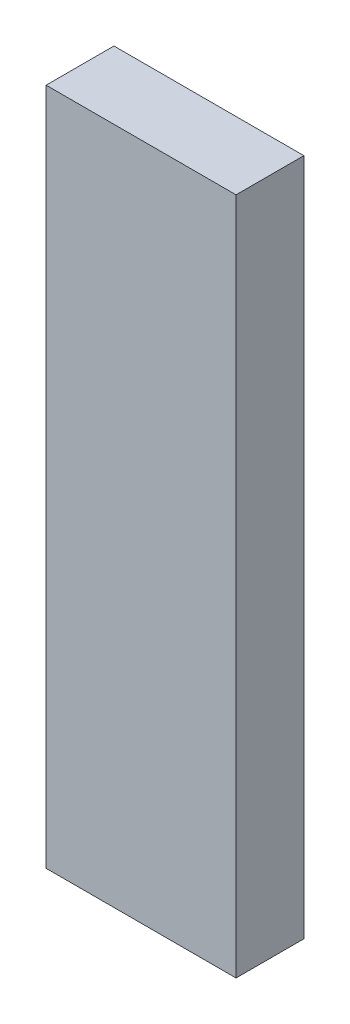
ISO-10303-21;
HEADER;
FILE_DESCRIPTION(('STEP AP214'),'2;1');
FILE_NAME('part.step','',(''),(''),'','','');
FILE_SCHEMA(('AUTOMOTIVE_DESIGN { 1 0 10303 214 1 1 1 1 }'));
ENDSEC;
DATA;
#1=APPLICATION_CONTEXT('core data for automotive mechanical design processes');
#2=APPLICATION_PROTOCOL_DEFINITION('international standard','automotive_design',2000,#1);
#3=PRODUCT_CONTEXT('',#1,'mechanical');
#4=PRODUCT('Part','Part','',(#3));
#5=PRODUCT_RELATED_PRODUCT_CATEGORY('part','',(#4));
#6=PRODUCT_DEFINITION_FORMATION('','',#4);
#7=PRODUCT_DEFINITION_CONTEXT('part definition',#1,'design');
#8=PRODUCT_DEFINITION('design','',#6,#7);
#9=PRODUCT_DEFINITION_SHAPE('','',#8);
#10=(LENGTH_UNIT() NAMED_UNIT(*) SI_UNIT(.MILLI.,.METRE.));
#11=(NAMED_UNIT(*) PLANE_ANGLE_UNIT() SI_UNIT($,.RADIAN.));
#12=(NAMED_UNIT(*) SI_UNIT($,.STERADIAN.) SOLID_ANGLE_UNIT());
#13=UNCERTAINTY_MEASURE_WITH_UNIT(LENGTH_MEASURE(1.E-05),#10,'distance_accuracy_value','');
#14=(GEOMETRIC_REPRESENTATION_CONTEXT(3) GLOBAL_UNCERTAINTY_ASSIGNED_CONTEXT((#13)) GLOBAL_UNIT_ASSIGNED_CONTEXT((#10,
#11,#12)) REPRESENTATION_CONTEXT('',''));
#15=CARTESIAN_POINT('',(0.,0.,0.));
#16=DIRECTION('',(0.,0.,1.));
#17=DIRECTION('',(1.,0.,0.));
#18=AXIS2_PLACEMENT_3D('',#15,#16,#17);
#19=CARTESIAN_POINT('',(-0.653139315545561,125.,25.));
#20=DIRECTION('',(0.,1.,0.));
#21=DIRECTION('',(-1.,0.,0.));
#22=AXIS2_PLACEMENT_3D('',#19,#20,#21);
#23=PLANE('',#22);
#24=DIRECTION('',(1.,0.,0.));
#25=VECTOR('',#24,1.);
#26=CARTESIAN_POINT('',(-0.653139315545561,125.,0.));
#27=LINE('',#26,#25);
#28=CARTESIAN_POINT('',(-35.,125.,0.));
#29=VERTEX_POINT('',#28);
#30=CARTESIAN_POINT('',(35.,125.,0.));
#31=VERTEX_POINT('',#30);
#32=EDGE_CURVE('E101',#29,#31,#27,.T.);
#33=ORIENTED_EDGE('',*,*,#32,.F.);
#34=DIRECTION('',(0.,0.,-1.));
#35=VECTOR('',#34,1.);
#36=CARTESIAN_POINT('',(-35.,125.,25.));
#37=LINE('',#36,#35);
#38=CARTESIAN_POINT('',(-35.,125.,25.));
#39=VERTEX_POINT('',#38);
#40=EDGE_CURVE('E10',#39,#29,#37,.T.);
#41=ORIENTED_EDGE('',*,*,#40,.F.);
#42=DIRECTION('',(1.,0.,0.));
#43=VECTOR('',#42,1.);
#44=CARTESIAN_POINT('',(-0.653139315545561,125.,25.));
#45=LINE('',#44,#43);
#46=CARTESIAN_POINT('',(35.,125.,25.));
#47=VERTEX_POINT('',#46);
#48=EDGE_CURVE('E79',#39,#47,#45,.T.);
#49=ORIENTED_EDGE('',*,*,#48,.T.);
#50=DIRECTION('',(0.,0.,-1.));
#51=VECTOR('',#50,1.);
#52=CARTESIAN_POINT('',(35.,125.,25.));
#53=LINE('',#52,#51);
#54=EDGE_CURVE('E38',#47,#31,#53,.T.);
#55=ORIENTED_EDGE('',*,*,#54,.T.);
#56=EDGE_LOOP('',(#33,#41,#49,#55));
#57=FACE_BOUND('',#56,.T.);
#58=ADVANCED_FACE('F16',(#57),#23,.T.);
#59=CARTESIAN_POINT('',(-35.,-93.645162412063,25.));
#60=DIRECTION('',(1.,0.,0.));
#61=DIRECTION('',(0.,0.,-1.));
#62=AXIS2_PLACEMENT_3D('',#59,#60,#61);
#63=PLANE('',#62);
#64=DIRECTION('',(0.,-1.,0.));
#65=VECTOR('',#64,1.);
#66=CARTESIAN_POINT('',(-35.,-93.645162412063,0.));
#67=LINE('',#66,#65);
#68=CARTESIAN_POINT('',(-35.,-125.,0.));
#69=VERTEX_POINT('',#68);
#70=EDGE_CURVE('E86',#29,#69,#67,.T.);
#71=ORIENTED_EDGE('',*,*,#70,.T.);
#72=DIRECTION('',(0.,0.,-1.));
#73=VECTOR('',#72,1.);
#74=CARTESIAN_POINT('',(-35.,-125.,25.));
#75=LINE('',#74,#73);
#76=CARTESIAN_POINT('',(-35.,-125.,25.));
#77=VERTEX_POINT('',#76);
#78=EDGE_CURVE('E25',#77,#69,#75,.T.);
#79=ORIENTED_EDGE('',*,*,#78,.F.);
#80=DIRECTION('',(0.,-1.,0.));
#81=VECTOR('',#80,1.);
#82=CARTESIAN_POINT('',(-35.,-93.645162412063,25.));
#83=LINE('',#82,#81);
#84=EDGE_CURVE('E73',#39,#77,#83,.T.);
#85=ORIENTED_EDGE('',*,*,#84,.F.);
#86=ORIENTED_EDGE('',*,*,#40,.T.);
#87=EDGE_LOOP('',(#71,#79,#85,#86));
#88=FACE_BOUND('',#87,.T.);
#89=ADVANCED_FACE('F84',(#88),#63,.F.);
#90=CARTESIAN_POINT('',(-0.653139315545559,-125.,25.));
#91=DIRECTION('',(0.,1.,0.));
#92=DIRECTION('',(-1.,0.,0.));
#93=AXIS2_PLACEMENT_3D('',#90,#91,#92);
#94=PLANE('',#93);
#95=DIRECTION('',(1.,0.,0.));
#96=VECTOR('',#95,1.);
#97=CARTESIAN_POINT('',(-0.653139315545559,-125.,0.));
#98=LINE('',#97,#96);
#99=CARTESIAN_POINT('',(35.,-125.,0.));
#100=VERTEX_POINT('',#99);
#101=EDGE_CURVE('E105',#69,#100,#98,.T.);
#102=ORIENTED_EDGE('',*,*,#101,.T.);
#103=DIRECTION('',(0.,0.,-1.));
#104=VECTOR('',#103,1.);
#105=CARTESIAN_POINT('',(35.,-125.,25.));
#106=LINE('',#105,#104);
#107=CARTESIAN_POINT('',(35.,-125.,25.));
#108=VERTEX_POINT('',#107);
#109=EDGE_CURVE('E57',#108,#100,#106,.T.);
#110=ORIENTED_EDGE('',*,*,#109,.F.);
#111=DIRECTION('',(1.,0.,0.));
#112=VECTOR('',#111,1.);
#113=CARTESIAN_POINT('',(-0.653139315545559,-125.,25.));
#114=LINE('',#113,#112);
#115=EDGE_CURVE('E78',#77,#108,#114,.T.);
#116=ORIENTED_EDGE('',*,*,#115,.F.);
#117=ORIENTED_EDGE('',*,*,#78,.T.);
#118=EDGE_LOOP('',(#102,#110,#116,#117));
#119=FACE_BOUND('',#118,.T.);
#120=ADVANCED_FACE('F90',(#119),#94,.F.);
#121=CARTESIAN_POINT('',(35.,-93.645162412063,25.));
#122=DIRECTION('',(1.,0.,0.));
#123=DIRECTION('',(0.,0.,-1.));
#124=AXIS2_PLACEMENT_3D('',#121,#122,#123);
#125=PLANE('',#124);
#126=DIRECTION('',(0.,-1.,0.));
#127=VECTOR('',#126,1.);
#128=CARTESIAN_POINT('',(35.,-93.645162412063,0.));
#129=LINE('',#128,#127);
#130=EDGE_CURVE('E107',#31,#100,#129,.T.);
#131=ORIENTED_EDGE('',*,*,#130,.F.);
#132=ORIENTED_EDGE('',*,*,#54,.F.);
#133=DIRECTION('',(0.,-1.,0.));
#134=VECTOR('',#133,1.);
#135=CARTESIAN_POINT('',(35.,-93.645162412063,25.));
#136=LINE('',#135,#134);
#137=EDGE_CURVE('E92',#47,#108,#136,.T.);
#138=ORIENTED_EDGE('',*,*,#137,.T.);
#139=ORIENTED_EDGE('',*,*,#109,.T.);
#140=EDGE_LOOP('',(#131,#132,#138,#139));
#141=FACE_BOUND('',#140,.T.);
#142=ADVANCED_FACE('F122',(#141),#125,.T.);
#143=CARTESIAN_POINT('',(0.,0.,25.));
#144=DIRECTION('',(0.,0.,1.));
#145=DIRECTION('',(1.,0.,0.));
#146=AXIS2_PLACEMENT_3D('',#143,#144,#145);
#147=PLANE('',#146);
#148=ORIENTED_EDGE('',*,*,#48,.F.);
#149=ORIENTED_EDGE('',*,*,#84,.T.);
#150=ORIENTED_EDGE('',*,*,#115,.T.);
#151=ORIENTED_EDGE('',*,*,#137,.F.);
#152=EDGE_LOOP('',(#148,#149,#150,#151));
#153=FACE_BOUND('',#152,.T.);
#154=ADVANCED_FACE('F75',(#153),#147,.T.);
#155=CARTESIAN_POINT('',(0.,0.,0.));
#156=DIRECTION('',(0.,0.,1.));
#157=DIRECTION('',(1.,0.,0.));
#158=AXIS2_PLACEMENT_3D('',#155,#156,#157);
#159=PLANE('',#158);
#160=ORIENTED_EDGE('',*,*,#32,.T.);
#161=ORIENTED_EDGE('',*,*,#130,.T.);
#162=ORIENTED_EDGE('',*,*,#101,.F.);
#163=ORIENTED_EDGE('',*,*,#70,.F.);
#164=EDGE_LOOP('',(#160,#161,#162,#163));
#165=FACE_BOUND('',#164,.T.);
#166=ADVANCED_FACE('F130',(#165),#159,.F.);
#167=CLOSED_SHELL('',(#58,#89,#120,#142,#154,#166));
#168=MANIFOLD_SOLID_BREP('B1',#167);
#169=ADVANCED_BREP_SHAPE_REPRESENTATION('',(#18,#168),#14);
#170=SHAPE_DEFINITION_REPRESENTATION(#9,#169);
ENDSEC;
END-ISO-10303-21;
